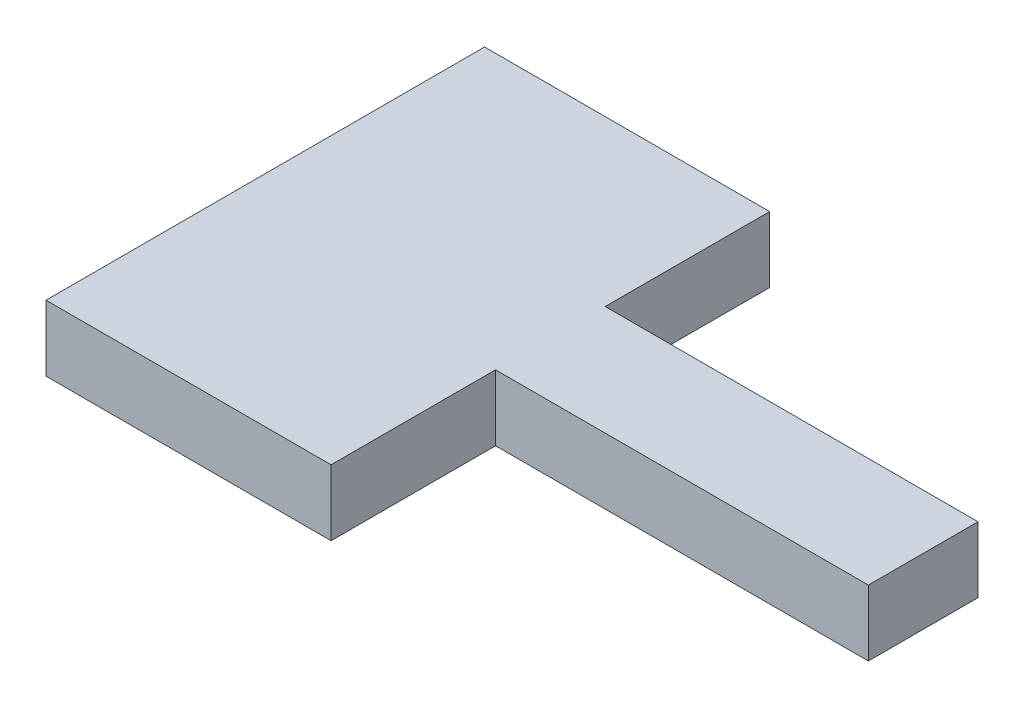
ISO-10303-21;
HEADER;
FILE_DESCRIPTION(('STEP AP214'),'2;1');
FILE_NAME('part.step','',(''),(''),'','','');
FILE_SCHEMA(('AUTOMOTIVE_DESIGN { 1 0 10303 214 1 1 1 1 }'));
ENDSEC;
DATA;
#1=APPLICATION_CONTEXT('core data for automotive mechanical design processes');
#2=APPLICATION_PROTOCOL_DEFINITION('international standard','automotive_design',2000,#1);
#3=PRODUCT_CONTEXT('',#1,'mechanical');
#4=PRODUCT('Part','Part','',(#3));
#5=PRODUCT_RELATED_PRODUCT_CATEGORY('part','',(#4));
#6=PRODUCT_DEFINITION_FORMATION('','',#4);
#7=PRODUCT_DEFINITION_CONTEXT('part definition',#1,'design');
#8=PRODUCT_DEFINITION('design','',#6,#7);
#9=PRODUCT_DEFINITION_SHAPE('','',#8);
#10=(LENGTH_UNIT() NAMED_UNIT(*) SI_UNIT(.MILLI.,.METRE.));
#11=(NAMED_UNIT(*) PLANE_ANGLE_UNIT() SI_UNIT($,.RADIAN.));
#12=(NAMED_UNIT(*) SI_UNIT($,.STERADIAN.) SOLID_ANGLE_UNIT());
#13=UNCERTAINTY_MEASURE_WITH_UNIT(LENGTH_MEASURE(1.E-05),#10,'distance_accuracy_value','');
#14=(GEOMETRIC_REPRESENTATION_CONTEXT(3) GLOBAL_UNCERTAINTY_ASSIGNED_CONTEXT((#13)) GLOBAL_UNIT_ASSIGNED_CONTEXT((#10,
#11,#12)) REPRESENTATION_CONTEXT('',''));
#15=CARTESIAN_POINT('',(0.,0.,0.));
#16=DIRECTION('',(0.,0.,1.));
#17=DIRECTION('',(1.,0.,0.));
#18=AXIS2_PLACEMENT_3D('',#15,#16,#17);
#19=CARTESIAN_POINT('',(-6.5,3.,10.));
#20=DIRECTION('',(1.,0.,0.));
#21=DIRECTION('',(0.,0.,-1.));
#22=AXIS2_PLACEMENT_3D('',#19,#20,#21);
#23=PLANE('',#22);
#24=DIRECTION('',(0.,0.,1.));
#25=VECTOR('',#24,1.);
#26=CARTESIAN_POINT('',(-6.5,0.,10.));
#27=LINE('',#26,#25);
#28=CARTESIAN_POINT('',(-6.5,0.,-10.));
#29=VERTEX_POINT('',#28);
#30=CARTESIAN_POINT('',(-6.5,0.,10.));
#31=VERTEX_POINT('',#30);
#32=EDGE_CURVE('E146',#29,#31,#27,.T.);
#33=ORIENTED_EDGE('',*,*,#32,.T.);
#34=DIRECTION('',(0.,-1.,0.));
#35=VECTOR('',#34,1.);
#36=CARTESIAN_POINT('',(-6.5,3.,10.));
#37=LINE('',#36,#35);
#38=CARTESIAN_POINT('',(-6.5,3.,10.));
#39=VERTEX_POINT('',#38);
#40=EDGE_CURVE('E11',#39,#31,#37,.T.);
#41=ORIENTED_EDGE('',*,*,#40,.F.);
#42=DIRECTION('',(0.,0.,1.));
#43=VECTOR('',#42,1.);
#44=CARTESIAN_POINT('',(-6.5,3.,10.));
#45=LINE('',#44,#43);
#46=CARTESIAN_POINT('',(-6.5,3.,-10.));
#47=VERTEX_POINT('',#46);
#48=EDGE_CURVE('E168',#47,#39,#45,.T.);
#49=ORIENTED_EDGE('',*,*,#48,.F.);
#50=DIRECTION('',(0.,-1.,0.));
#51=VECTOR('',#50,1.);
#52=CARTESIAN_POINT('',(-6.5,3.,-10.));
#53=LINE('',#52,#51);
#54=EDGE_CURVE('E142',#47,#29,#53,.T.);
#55=ORIENTED_EDGE('',*,*,#54,.T.);
#56=EDGE_LOOP('',(#33,#41,#49,#55));
#57=FACE_BOUND('',#56,.T.);
#58=ADVANCED_FACE('F45',(#57),#23,.F.);
#59=CARTESIAN_POINT('',(6.5,3.,10.));
#60=DIRECTION('',(0.,0.,-1.));
#61=DIRECTION('',(-1.,0.,0.));
#62=AXIS2_PLACEMENT_3D('',#59,#60,#61);
#63=PLANE('',#62);
#64=DIRECTION('',(1.,0.,0.));
#65=VECTOR('',#64,1.);
#66=CARTESIAN_POINT('',(6.5,0.,10.));
#67=LINE('',#66,#65);
#68=CARTESIAN_POINT('',(6.5,0.,10.));
#69=VERTEX_POINT('',#68);
#70=EDGE_CURVE('E150',#31,#69,#67,.T.);
#71=ORIENTED_EDGE('',*,*,#70,.T.);
#72=DIRECTION('',(0.,-1.,0.));
#73=VECTOR('',#72,1.);
#74=CARTESIAN_POINT('',(6.5,3.,10.));
#75=LINE('',#74,#73);
#76=CARTESIAN_POINT('',(6.5,3.,10.));
#77=VERTEX_POINT('',#76);
#78=EDGE_CURVE('E54',#77,#69,#75,.T.);
#79=ORIENTED_EDGE('',*,*,#78,.F.);
#80=DIRECTION('',(1.,0.,0.));
#81=VECTOR('',#80,1.);
#82=CARTESIAN_POINT('',(6.5,3.,10.));
#83=LINE('',#82,#81);
#84=EDGE_CURVE('E105',#39,#77,#83,.T.);
#85=ORIENTED_EDGE('',*,*,#84,.F.);
#86=ORIENTED_EDGE('',*,*,#40,.T.);
#87=EDGE_LOOP('',(#71,#79,#85,#86));
#88=FACE_BOUND('',#87,.T.);
#89=ADVANCED_FACE('F214',(#88),#63,.F.);
#90=CARTESIAN_POINT('',(6.5,3.,10.));
#91=DIRECTION('',(-1.,0.,0.));
#92=DIRECTION('',(0.,0.,1.));
#93=AXIS2_PLACEMENT_3D('',#90,#91,#92);
#94=PLANE('',#93);
#95=DIRECTION('',(0.,0.,-1.));
#96=VECTOR('',#95,1.);
#97=CARTESIAN_POINT('',(6.5,0.,10.));
#98=LINE('',#97,#96);
#99=CARTESIAN_POINT('',(6.5,0.,2.5));
#100=VERTEX_POINT('',#99);
#101=EDGE_CURVE('E153',#69,#100,#98,.T.);
#102=ORIENTED_EDGE('',*,*,#101,.T.);
#103=DIRECTION('',(0.,-1.,0.));
#104=VECTOR('',#103,1.);
#105=CARTESIAN_POINT('',(6.5,3.,2.5));
#106=LINE('',#105,#104);
#107=CARTESIAN_POINT('',(6.5,3.,2.5));
#108=VERTEX_POINT('',#107);
#109=EDGE_CURVE('E179',#108,#100,#106,.T.);
#110=ORIENTED_EDGE('',*,*,#109,.F.);
#111=DIRECTION('',(0.,0.,-1.));
#112=VECTOR('',#111,1.);
#113=CARTESIAN_POINT('',(6.5,3.,10.));
#114=LINE('',#113,#112);
#115=EDGE_CURVE('E189',#77,#108,#114,.T.);
#116=ORIENTED_EDGE('',*,*,#115,.F.);
#117=ORIENTED_EDGE('',*,*,#78,.T.);
#118=EDGE_LOOP('',(#102,#110,#116,#117));
#119=FACE_BOUND('',#118,.T.);
#120=ADVANCED_FACE('F187',(#119),#94,.F.);
#121=CARTESIAN_POINT('',(6.5,3.,2.5));
#122=DIRECTION('',(0.,0.,-1.));
#123=DIRECTION('',(-1.,0.,0.));
#124=AXIS2_PLACEMENT_3D('',#121,#122,#123);
#125=PLANE('',#124);
#126=DIRECTION('',(1.,0.,0.));
#127=VECTOR('',#126,1.);
#128=CARTESIAN_POINT('',(6.5,0.,2.5));
#129=LINE('',#128,#127);
#130=CARTESIAN_POINT('',(23.5,0.,2.5));
#131=VERTEX_POINT('',#130);
#132=EDGE_CURVE('E156',#100,#131,#129,.T.);
#133=ORIENTED_EDGE('',*,*,#132,.T.);
#134=DIRECTION('',(0.,-1.,0.));
#135=VECTOR('',#134,1.);
#136=CARTESIAN_POINT('',(23.5,3.,2.5));
#137=LINE('',#136,#135);
#138=CARTESIAN_POINT('',(23.5,3.,2.5));
#139=VERTEX_POINT('',#138);
#140=EDGE_CURVE('E175',#139,#131,#137,.T.);
#141=ORIENTED_EDGE('',*,*,#140,.F.);
#142=DIRECTION('',(1.,0.,0.));
#143=VECTOR('',#142,1.);
#144=CARTESIAN_POINT('',(6.5,3.,2.5));
#145=LINE('',#144,#143);
#146=EDGE_CURVE('E202',#108,#139,#145,.T.);
#147=ORIENTED_EDGE('',*,*,#146,.F.);
#148=ORIENTED_EDGE('',*,*,#109,.T.);
#149=EDGE_LOOP('',(#133,#141,#147,#148));
#150=FACE_BOUND('',#149,.T.);
#151=ADVANCED_FACE('F197',(#150),#125,.F.);
#152=CARTESIAN_POINT('',(23.5,3.,-2.5));
#153=DIRECTION('',(-1.,0.,0.));
#154=DIRECTION('',(0.,0.,1.));
#155=AXIS2_PLACEMENT_3D('',#152,#153,#154);
#156=PLANE('',#155);
#157=DIRECTION('',(0.,0.,-1.));
#158=VECTOR('',#157,1.);
#159=CARTESIAN_POINT('',(23.5,0.,-2.5));
#160=LINE('',#159,#158);
#161=CARTESIAN_POINT('',(23.5,0.,-2.5));
#162=VERTEX_POINT('',#161);
#163=EDGE_CURVE('E159',#131,#162,#160,.T.);
#164=ORIENTED_EDGE('',*,*,#163,.T.);
#165=DIRECTION('',(0.,-1.,0.));
#166=VECTOR('',#165,1.);
#167=CARTESIAN_POINT('',(23.5,3.,-2.5));
#168=LINE('',#167,#166);
#169=CARTESIAN_POINT('',(23.5,3.,-2.5));
#170=VERTEX_POINT('',#169);
#171=EDGE_CURVE('E135',#170,#162,#168,.T.);
#172=ORIENTED_EDGE('',*,*,#171,.F.);
#173=DIRECTION('',(0.,0.,-1.));
#174=VECTOR('',#173,1.);
#175=CARTESIAN_POINT('',(23.5,3.,-2.5));
#176=LINE('',#175,#174);
#177=EDGE_CURVE('E124',#139,#170,#176,.T.);
#178=ORIENTED_EDGE('',*,*,#177,.F.);
#179=ORIENTED_EDGE('',*,*,#140,.T.);
#180=EDGE_LOOP('',(#164,#172,#178,#179));
#181=FACE_BOUND('',#180,.T.);
#182=ADVANCED_FACE('F200',(#181),#156,.F.);
#183=CARTESIAN_POINT('',(6.5,3.,-2.5));
#184=DIRECTION('',(0.,0.,1.));
#185=DIRECTION('',(1.,0.,0.));
#186=AXIS2_PLACEMENT_3D('',#183,#184,#185);
#187=PLANE('',#186);
#188=DIRECTION('',(-1.,0.,0.));
#189=VECTOR('',#188,1.);
#190=CARTESIAN_POINT('',(6.5,0.,-2.5));
#191=LINE('',#190,#189);
#192=CARTESIAN_POINT('',(6.5,0.,-2.5));
#193=VERTEX_POINT('',#192);
#194=EDGE_CURVE('E133',#162,#193,#191,.T.);
#195=ORIENTED_EDGE('',*,*,#194,.T.);
#196=DIRECTION('',(0.,-1.,0.));
#197=VECTOR('',#196,1.);
#198=CARTESIAN_POINT('',(6.5,3.,-2.5));
#199=LINE('',#198,#197);
#200=CARTESIAN_POINT('',(6.5,3.,-2.5));
#201=VERTEX_POINT('',#200);
#202=EDGE_CURVE('E130',#201,#193,#199,.T.);
#203=ORIENTED_EDGE('',*,*,#202,.F.);
#204=DIRECTION('',(-1.,0.,0.));
#205=VECTOR('',#204,1.);
#206=CARTESIAN_POINT('',(6.5,3.,-2.5));
#207=LINE('',#206,#205);
#208=EDGE_CURVE('E118',#170,#201,#207,.T.);
#209=ORIENTED_EDGE('',*,*,#208,.F.);
#210=ORIENTED_EDGE('',*,*,#171,.T.);
#211=EDGE_LOOP('',(#195,#203,#209,#210));
#212=FACE_BOUND('',#211,.T.);
#213=ADVANCED_FACE('F131',(#212),#187,.F.);
#214=CARTESIAN_POINT('',(6.5,3.,-2.5));
#215=DIRECTION('',(-1.,0.,0.));
#216=DIRECTION('',(0.,0.,1.));
#217=AXIS2_PLACEMENT_3D('',#214,#215,#216);
#218=PLANE('',#217);
#219=DIRECTION('',(0.,0.,-1.));
#220=VECTOR('',#219,1.);
#221=CARTESIAN_POINT('',(6.5,0.,-2.5));
#222=LINE('',#221,#220);
#223=CARTESIAN_POINT('',(6.5,0.,-10.));
#224=VERTEX_POINT('',#223);
#225=EDGE_CURVE('E91',#193,#224,#222,.T.);
#226=ORIENTED_EDGE('',*,*,#225,.T.);
#227=DIRECTION('',(0.,-1.,0.));
#228=VECTOR('',#227,1.);
#229=CARTESIAN_POINT('',(6.5,3.,-10.));
#230=LINE('',#229,#228);
#231=CARTESIAN_POINT('',(6.5,3.,-10.));
#232=VERTEX_POINT('',#231);
#233=EDGE_CURVE('E136',#232,#224,#230,.T.);
#234=ORIENTED_EDGE('',*,*,#233,.F.);
#235=DIRECTION('',(0.,0.,-1.));
#236=VECTOR('',#235,1.);
#237=CARTESIAN_POINT('',(6.5,3.,-2.5));
#238=LINE('',#237,#236);
#239=EDGE_CURVE('E122',#201,#232,#238,.T.);
#240=ORIENTED_EDGE('',*,*,#239,.F.);
#241=ORIENTED_EDGE('',*,*,#202,.T.);
#242=EDGE_LOOP('',(#226,#234,#240,#241));
#243=FACE_BOUND('',#242,.T.);
#244=ADVANCED_FACE('F138',(#243),#218,.F.);
#245=CARTESIAN_POINT('',(6.5,3.,-10.));
#246=DIRECTION('',(0.,0.,1.));
#247=DIRECTION('',(1.,0.,0.));
#248=AXIS2_PLACEMENT_3D('',#245,#246,#247);
#249=PLANE('',#248);
#250=DIRECTION('',(-1.,0.,0.));
#251=VECTOR('',#250,1.);
#252=CARTESIAN_POINT('',(6.5,0.,-10.));
#253=LINE('',#252,#251);
#254=EDGE_CURVE('E97',#224,#29,#253,.T.);
#255=ORIENTED_EDGE('',*,*,#254,.T.);
#256=ORIENTED_EDGE('',*,*,#54,.F.);
#257=DIRECTION('',(-1.,0.,0.));
#258=VECTOR('',#257,1.);
#259=CARTESIAN_POINT('',(6.5,3.,-10.));
#260=LINE('',#259,#258);
#261=EDGE_CURVE('E62',#232,#47,#260,.T.);
#262=ORIENTED_EDGE('',*,*,#261,.F.);
#263=ORIENTED_EDGE('',*,*,#233,.T.);
#264=EDGE_LOOP('',(#255,#256,#262,#263));
#265=FACE_BOUND('',#264,.T.);
#266=ADVANCED_FACE('F230',(#265),#249,.F.);
#267=CARTESIAN_POINT('',(0.,3.,0.));
#268=DIRECTION('',(0.,1.,0.));
#269=DIRECTION('',(0.,0.,1.));
#270=AXIS2_PLACEMENT_3D('',#267,#268,#269);
#271=PLANE('',#270);
#272=ORIENTED_EDGE('',*,*,#48,.T.);
#273=ORIENTED_EDGE('',*,*,#84,.T.);
#274=ORIENTED_EDGE('',*,*,#115,.T.);
#275=ORIENTED_EDGE('',*,*,#146,.T.);
#276=ORIENTED_EDGE('',*,*,#177,.T.);
#277=ORIENTED_EDGE('',*,*,#208,.T.);
#278=ORIENTED_EDGE('',*,*,#239,.T.);
#279=ORIENTED_EDGE('',*,*,#261,.T.);
#280=EDGE_LOOP('',(#272,#273,#274,#275,#276,#277,#278,#279));
#281=FACE_BOUND('',#280,.T.);
#282=ADVANCED_FACE('F120',(#281),#271,.T.);
#283=CARTESIAN_POINT('',(0.,0.,0.));
#284=DIRECTION('',(0.,1.,0.));
#285=DIRECTION('',(0.,0.,1.));
#286=AXIS2_PLACEMENT_3D('',#283,#284,#285);
#287=PLANE('',#286);
#288=ORIENTED_EDGE('',*,*,#32,.F.);
#289=ORIENTED_EDGE('',*,*,#254,.F.);
#290=ORIENTED_EDGE('',*,*,#225,.F.);
#291=ORIENTED_EDGE('',*,*,#194,.F.);
#292=ORIENTED_EDGE('',*,*,#163,.F.);
#293=ORIENTED_EDGE('',*,*,#132,.F.);
#294=ORIENTED_EDGE('',*,*,#101,.F.);
#295=ORIENTED_EDGE('',*,*,#70,.F.);
#296=EDGE_LOOP('',(#288,#289,#290,#291,#292,#293,#294,#295));
#297=FACE_BOUND('',#296,.T.);
#298=ADVANCED_FACE('F193',(#297),#287,.F.);
#299=CLOSED_SHELL('',(#58,#89,#120,#151,#182,#213,#244,#266,#282,#298));
#300=MANIFOLD_SOLID_BREP('B2',#299);
#301=ADVANCED_BREP_SHAPE_REPRESENTATION('',(#18,#300),#14);
#302=SHAPE_DEFINITION_REPRESENTATION(#9,#301);
ENDSEC;
END-ISO-10303-21;
